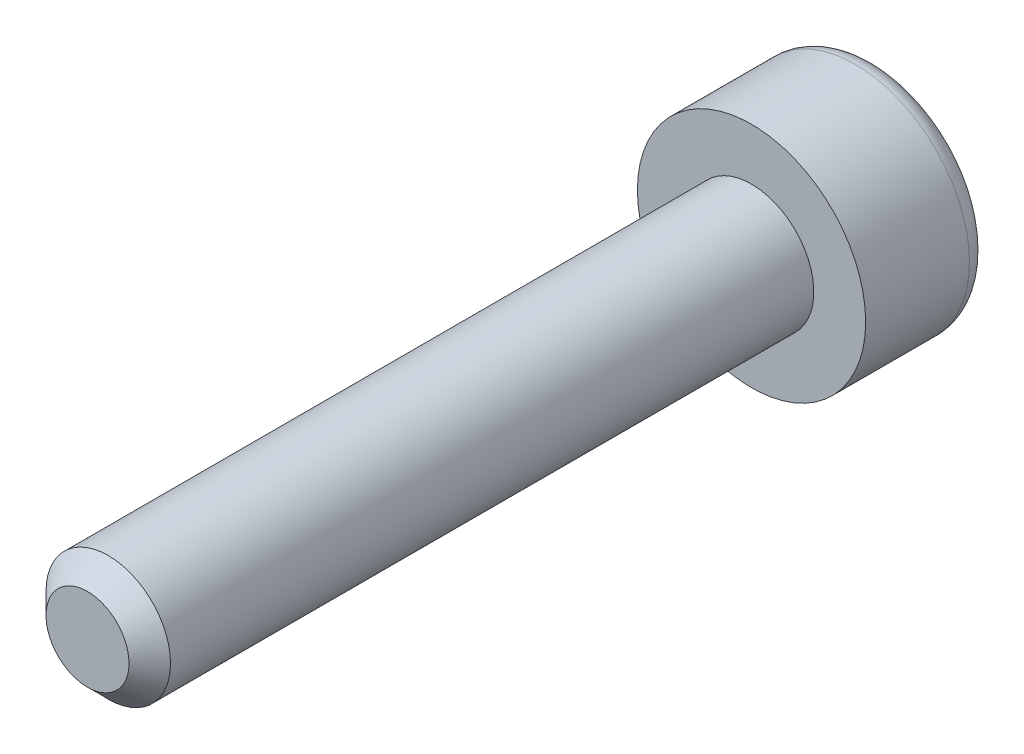
ISO-10303-21;
HEADER;
FILE_DESCRIPTION(('STEP AP214'),'2;1');
FILE_NAME('part.step','',(''),(''),'','','');
FILE_SCHEMA(('AUTOMOTIVE_DESIGN { 1 0 10303 214 1 1 1 1 }'));
ENDSEC;
DATA;
#1=APPLICATION_CONTEXT('core data for automotive mechanical design processes');
#2=APPLICATION_PROTOCOL_DEFINITION('international standard','automotive_design',2000,#1);
#3=PRODUCT_CONTEXT('',#1,'mechanical');
#4=PRODUCT('Part','Part','',(#3));
#5=PRODUCT_RELATED_PRODUCT_CATEGORY('part','',(#4));
#6=PRODUCT_DEFINITION_FORMATION('','',#4);
#7=PRODUCT_DEFINITION_CONTEXT('part definition',#1,'design');
#8=PRODUCT_DEFINITION('design','',#6,#7);
#9=PRODUCT_DEFINITION_SHAPE('','',#8);
#10=(LENGTH_UNIT() NAMED_UNIT(*) SI_UNIT(.MILLI.,.METRE.));
#11=(NAMED_UNIT(*) PLANE_ANGLE_UNIT() SI_UNIT($,.RADIAN.));
#12=(NAMED_UNIT(*) SI_UNIT($,.STERADIAN.) SOLID_ANGLE_UNIT());
#13=UNCERTAINTY_MEASURE_WITH_UNIT(LENGTH_MEASURE(1.E-05),#10,'distance_accuracy_value','');
#14=(GEOMETRIC_REPRESENTATION_CONTEXT(3) GLOBAL_UNCERTAINTY_ASSIGNED_CONTEXT((#13)) GLOBAL_UNIT_ASSIGNED_CONTEXT((#10,
#11,#12)) REPRESENTATION_CONTEXT('',''));
#15=CARTESIAN_POINT('',(0.,0.,0.));
#16=DIRECTION('',(0.,0.,1.));
#17=DIRECTION('',(1.,0.,0.));
#18=AXIS2_PLACEMENT_3D('',#15,#16,#17);
#19=CARTESIAN_POINT('',(0.,0.,16.));
#20=DIRECTION('',(0.,0.,-1.));
#21=DIRECTION('',(-1.,0.,0.));
#22=AXIS2_PLACEMENT_3D('',#19,#20,#21);
#23=CYLINDRICAL_SURFACE('',#22,1.5);
#24=CARTESIAN_POINT('',(0.,0.,15.5));
#25=DIRECTION('',(0.,0.,1.));
#26=DIRECTION('',(1.,0.,0.));
#27=AXIS2_PLACEMENT_3D('',#24,#25,#26);
#28=CIRCLE('',#27,1.5);
#29=CARTESIAN_POINT('',(1.5,0.,15.5));
#30=VERTEX_POINT('',#29);
#31=EDGE_CURVE('E151',#30,#30,#28,.F.);
#32=ORIENTED_EDGE('',*,*,#31,.T.);
#33=EDGE_LOOP('',(#32));
#34=FACE_BOUND('',#33,.T.);
#35=CARTESIAN_POINT('',(0.,0.,0.));
#36=DIRECTION('',(0.,0.,-1.));
#37=DIRECTION('',(-1.,0.,0.));
#38=AXIS2_PLACEMENT_3D('',#35,#36,#37);
#39=CIRCLE('',#38,1.5);
#40=CARTESIAN_POINT('',(-1.5,0.,0.));
#41=VERTEX_POINT('',#40);
#42=EDGE_CURVE('E145',#41,#41,#39,.T.);
#43=ORIENTED_EDGE('',*,*,#42,.F.);
#44=EDGE_LOOP('',(#43));
#45=FACE_BOUND('',#44,.T.);
#46=ADVANCED_FACE('F34',(#34,#45),#23,.T.);
#47=CARTESIAN_POINT('',(0.,0.,16.));
#48=DIRECTION('',(0.,0.,1.));
#49=DIRECTION('',(1.,0.,0.));
#50=AXIS2_PLACEMENT_3D('',#47,#48,#49);
#51=PLANE('',#50);
#52=CARTESIAN_POINT('',(0.,0.,16.));
#53=DIRECTION('',(0.,0.,1.));
#54=DIRECTION('',(1.,0.,0.));
#55=AXIS2_PLACEMENT_3D('',#52,#53,#54);
#56=CIRCLE('',#55,0.999999999999999);
#57=CARTESIAN_POINT('',(0.999999999999999,0.,16.));
#58=VERTEX_POINT('',#57);
#59=EDGE_CURVE('E148',#58,#58,#56,.T.);
#60=ORIENTED_EDGE('',*,*,#59,.T.);
#61=EDGE_LOOP('',(#60));
#62=FACE_BOUND('',#61,.T.);
#63=ADVANCED_FACE('F172',(#62),#51,.T.);
#64=CARTESIAN_POINT('',(0.,0.,16.));
#65=DIRECTION('',(0.,0.,-1.));
#66=DIRECTION('',(-1.,0.,0.));
#67=AXIS2_PLACEMENT_3D('',#64,#65,#66);
#68=CONICAL_SURFACE('',#67,0.999999999999999,0.785398163397445);
#69=ORIENTED_EDGE('',*,*,#31,.F.);
#70=EDGE_LOOP('',(#69));
#71=FACE_BOUND('',#70,.T.);
#72=ORIENTED_EDGE('',*,*,#59,.F.);
#73=EDGE_LOOP('',(#72));
#74=FACE_BOUND('',#73,.T.);
#75=ADVANCED_FACE('F177',(#71,#74),#68,.T.);
#76=CARTESIAN_POINT('',(0.,0.,0.));
#77=DIRECTION('',(0.,0.,-1.));
#78=DIRECTION('',(-1.,0.,0.));
#79=AXIS2_PLACEMENT_3D('',#76,#77,#78);
#80=PLANE('',#79);
#81=CARTESIAN_POINT('',(0.,0.,0.));
#82=DIRECTION('',(0.,0.,-1.));
#83=DIRECTION('',(-1.,0.,0.));
#84=AXIS2_PLACEMENT_3D('',#81,#82,#83);
#85=CIRCLE('',#84,2.75);
#86=CARTESIAN_POINT('',(-2.75,0.,0.));
#87=VERTEX_POINT('',#86);
#88=EDGE_CURVE('E136',#87,#87,#85,.T.);
#89=ORIENTED_EDGE('',*,*,#88,.F.);
#90=EDGE_LOOP('',(#89));
#91=FACE_BOUND('',#90,.T.);
#92=ORIENTED_EDGE('',*,*,#42,.T.);
#93=EDGE_LOOP('',(#92));
#94=FACE_BOUND('',#93,.T.);
#95=ADVANCED_FACE('F183',(#91,#94),#80,.F.);
#96=CARTESIAN_POINT('',(0.,0.,-3.));
#97=DIRECTION('',(0.,0.,1.));
#98=DIRECTION('',(1.,0.,0.));
#99=AXIS2_PLACEMENT_3D('',#96,#97,#98);
#100=CYLINDRICAL_SURFACE('',#99,2.75);
#101=CARTESIAN_POINT('',(0.,0.,-2.5));
#102=DIRECTION('',(0.,0.,-1.));
#103=DIRECTION('',(-1.,0.,0.));
#104=AXIS2_PLACEMENT_3D('',#101,#102,#103);
#105=CIRCLE('',#104,2.75);
#106=CARTESIAN_POINT('',(-2.75,0.,-2.5));
#107=VERTEX_POINT('',#106);
#108=EDGE_CURVE('E11',#107,#107,#105,.F.);
#109=ORIENTED_EDGE('',*,*,#108,.T.);
#110=EDGE_LOOP('',(#109));
#111=FACE_BOUND('',#110,.T.);
#112=ORIENTED_EDGE('',*,*,#88,.T.);
#113=EDGE_LOOP('',(#112));
#114=FACE_BOUND('',#113,.T.);
#115=ADVANCED_FACE('F167',(#111,#114),#100,.T.);
#116=CARTESIAN_POINT('',(0.,0.,-3.));
#117=DIRECTION('',(0.,0.,-1.));
#118=DIRECTION('',(-1.,0.,0.));
#119=AXIS2_PLACEMENT_3D('',#116,#117,#118);
#120=PLANE('',#119);
#121=DIRECTION('',(0.866025403784439,0.5,0.));
#122=VECTOR('',#121,1.);
#123=CARTESIAN_POINT('',(-1.5,0.866025403784438,-3.));
#124=LINE('',#123,#122);
#125=CARTESIAN_POINT('',(-1.5,0.866025403784438,-3.));
#126=VERTEX_POINT('',#125);
#127=CARTESIAN_POINT('',(0.,1.73205080756888,-3.));
#128=VERTEX_POINT('',#127);
#129=EDGE_CURVE('E48',#126,#128,#124,.T.);
#130=ORIENTED_EDGE('',*,*,#129,.F.);
#131=DIRECTION('',(0.,1.,0.));
#132=VECTOR('',#131,1.);
#133=CARTESIAN_POINT('',(-1.5,-0.86602540378444,-3.));
#134=LINE('',#133,#132);
#135=CARTESIAN_POINT('',(-1.5,-0.86602540378444,-3.));
#136=VERTEX_POINT('',#135);
#137=EDGE_CURVE('E118',#136,#126,#134,.T.);
#138=ORIENTED_EDGE('',*,*,#137,.F.);
#139=DIRECTION('',(-0.866025403784439,0.5,0.));
#140=VECTOR('',#139,1.);
#141=CARTESIAN_POINT('',(0.,-1.73205080756888,-3.));
#142=LINE('',#141,#140);
#143=CARTESIAN_POINT('',(0.,-1.73205080756888,-3.));
#144=VERTEX_POINT('',#143);
#145=EDGE_CURVE('E112',#144,#136,#142,.T.);
#146=ORIENTED_EDGE('',*,*,#145,.F.);
#147=DIRECTION('',(-0.866025403784439,-0.5,0.));
#148=VECTOR('',#147,1.);
#149=CARTESIAN_POINT('',(1.5,-0.86602540378444,-3.));
#150=LINE('',#149,#148);
#151=CARTESIAN_POINT('',(1.5,-0.86602540378444,-3.));
#152=VERTEX_POINT('',#151);
#153=EDGE_CURVE('E110',#152,#144,#150,.T.);
#154=ORIENTED_EDGE('',*,*,#153,.F.);
#155=DIRECTION('',(0.,-1.,0.));
#156=VECTOR('',#155,1.);
#157=CARTESIAN_POINT('',(1.5,0.866025403784437,-3.));
#158=LINE('',#157,#156);
#159=CARTESIAN_POINT('',(1.5,0.866025403784437,-3.));
#160=VERTEX_POINT('',#159);
#161=EDGE_CURVE('E91',#160,#152,#158,.T.);
#162=ORIENTED_EDGE('',*,*,#161,.F.);
#163=DIRECTION('',(0.866025403784439,-0.5,0.));
#164=VECTOR('',#163,1.);
#165=CARTESIAN_POINT('',(0.,1.73205080756888,-3.));
#166=LINE('',#165,#164);
#167=EDGE_CURVE('E102',#128,#160,#166,.T.);
#168=ORIENTED_EDGE('',*,*,#167,.F.);
#169=EDGE_LOOP('',(#130,#138,#146,#154,#162,#168));
#170=FACE_BOUND('',#169,.T.);
#171=CARTESIAN_POINT('',(0.,0.,-3.));
#172=DIRECTION('',(0.,0.,-1.));
#173=DIRECTION('',(-1.,0.,0.));
#174=AXIS2_PLACEMENT_3D('',#171,#172,#173);
#175=CIRCLE('',#174,2.25);
#176=CARTESIAN_POINT('',(-2.25,0.,-3.));
#177=VERTEX_POINT('',#176);
#178=EDGE_CURVE('E41',#177,#177,#175,.T.);
#179=ORIENTED_EDGE('',*,*,#178,.T.);
#180=EDGE_LOOP('',(#179));
#181=FACE_BOUND('',#180,.T.);
#182=ADVANCED_FACE('F106',(#170,#181),#120,.T.);
#183=CARTESIAN_POINT('',(0.,0.,-2.5));
#184=DIRECTION('',(0.,0.,-1.));
#185=DIRECTION('',(-1.,0.,0.));
#186=AXIS2_PLACEMENT_3D('',#183,#184,#185);
#187=TOROIDAL_SURFACE('',#186,2.25,0.5);
#188=ORIENTED_EDGE('',*,*,#108,.F.);
#189=EDGE_LOOP('',(#188));
#190=FACE_BOUND('',#189,.T.);
#191=ORIENTED_EDGE('',*,*,#178,.F.);
#192=EDGE_LOOP('',(#191));
#193=FACE_BOUND('',#192,.T.);
#194=ADVANCED_FACE('F156',(#190,#193),#187,.T.);
#195=CARTESIAN_POINT('',(-1.5,0.866025403784438,-1.));
#196=DIRECTION('',(-0.5,0.866025403784439,0.));
#197=DIRECTION('',(-0.866025403784439,-0.5,0.));
#198=AXIS2_PLACEMENT_3D('',#195,#196,#197);
#199=PLANE('',#198);
#200=ORIENTED_EDGE('',*,*,#129,.T.);
#201=DIRECTION('',(0.,0.,-1.));
#202=VECTOR('',#201,1.);
#203=CARTESIAN_POINT('',(0.,1.73205080756888,-1.));
#204=LINE('',#203,#202);
#205=CARTESIAN_POINT('',(0.,1.73205080756888,-1.));
#206=VERTEX_POINT('',#205);
#207=EDGE_CURVE('E99',#206,#128,#204,.T.);
#208=ORIENTED_EDGE('',*,*,#207,.F.);
#209=DIRECTION('',(0.866025403784439,0.5,0.));
#210=VECTOR('',#209,1.);
#211=CARTESIAN_POINT('',(-1.5,0.866025403784438,-1.));
#212=LINE('',#211,#210);
#213=CARTESIAN_POINT('',(-1.5,0.866025403784438,-1.));
#214=VERTEX_POINT('',#213);
#215=EDGE_CURVE('E120',#214,#206,#212,.T.);
#216=ORIENTED_EDGE('',*,*,#215,.F.);
#217=DIRECTION('',(0.,0.,-1.));
#218=VECTOR('',#217,1.);
#219=CARTESIAN_POINT('',(-1.5,0.866025403784438,-1.));
#220=LINE('',#219,#218);
#221=EDGE_CURVE('E55',#214,#126,#220,.T.);
#222=ORIENTED_EDGE('',*,*,#221,.T.);
#223=EDGE_LOOP('',(#200,#208,#216,#222));
#224=FACE_BOUND('',#223,.T.);
#225=ADVANCED_FACE('F158',(#224),#199,.F.);
#226=CARTESIAN_POINT('',(-1.5,-0.86602540378444,-1.));
#227=DIRECTION('',(-1.,0.,0.));
#228=DIRECTION('',(0.,0.,1.));
#229=AXIS2_PLACEMENT_3D('',#226,#227,#228);
#230=PLANE('',#229);
#231=ORIENTED_EDGE('',*,*,#137,.T.);
#232=ORIENTED_EDGE('',*,*,#221,.F.);
#233=DIRECTION('',(0.,1.,0.));
#234=VECTOR('',#233,1.);
#235=CARTESIAN_POINT('',(-1.5,-0.86602540378444,-1.));
#236=LINE('',#235,#234);
#237=CARTESIAN_POINT('',(-1.5,-0.86602540378444,-1.));
#238=VERTEX_POINT('',#237);
#239=EDGE_CURVE('E132',#238,#214,#236,.T.);
#240=ORIENTED_EDGE('',*,*,#239,.F.);
#241=DIRECTION('',(0.,0.,-1.));
#242=VECTOR('',#241,1.);
#243=CARTESIAN_POINT('',(-1.5,-0.86602540378444,-1.));
#244=LINE('',#243,#242);
#245=EDGE_CURVE('E137',#238,#136,#244,.T.);
#246=ORIENTED_EDGE('',*,*,#245,.T.);
#247=EDGE_LOOP('',(#231,#232,#240,#246));
#248=FACE_BOUND('',#247,.T.);
#249=ADVANCED_FACE('F165',(#248),#230,.F.);
#250=CARTESIAN_POINT('',(0.,-1.73205080756888,-1.));
#251=DIRECTION('',(-0.5,-0.866025403784439,0.));
#252=DIRECTION('',(0.866025403784439,-0.5,0.));
#253=AXIS2_PLACEMENT_3D('',#250,#251,#252);
#254=PLANE('',#253);
#255=ORIENTED_EDGE('',*,*,#145,.T.);
#256=ORIENTED_EDGE('',*,*,#245,.F.);
#257=DIRECTION('',(-0.866025403784439,0.5,0.));
#258=VECTOR('',#257,1.);
#259=CARTESIAN_POINT('',(0.,-1.73205080756888,-1.));
#260=LINE('',#259,#258);
#261=CARTESIAN_POINT('',(0.,-1.73205080756888,-1.));
#262=VERTEX_POINT('',#261);
#263=EDGE_CURVE('E129',#262,#238,#260,.T.);
#264=ORIENTED_EDGE('',*,*,#263,.F.);
#265=DIRECTION('',(0.,0.,-1.));
#266=VECTOR('',#265,1.);
#267=CARTESIAN_POINT('',(0.,-1.73205080756888,-1.));
#268=LINE('',#267,#266);
#269=EDGE_CURVE('E139',#262,#144,#268,.T.);
#270=ORIENTED_EDGE('',*,*,#269,.T.);
#271=EDGE_LOOP('',(#255,#256,#264,#270));
#272=FACE_BOUND('',#271,.T.);
#273=ADVANCED_FACE('F243',(#272),#254,.F.);
#274=CARTESIAN_POINT('',(1.5,-0.86602540378444,-1.));
#275=DIRECTION('',(0.5,-0.866025403784439,0.));
#276=DIRECTION('',(0.866025403784439,0.5,0.));
#277=AXIS2_PLACEMENT_3D('',#274,#275,#276);
#278=PLANE('',#277);
#279=ORIENTED_EDGE('',*,*,#153,.T.);
#280=ORIENTED_EDGE('',*,*,#269,.F.);
#281=DIRECTION('',(-0.866025403784439,-0.5,0.));
#282=VECTOR('',#281,1.);
#283=CARTESIAN_POINT('',(1.5,-0.86602540378444,-1.));
#284=LINE('',#283,#282);
#285=CARTESIAN_POINT('',(1.5,-0.86602540378444,-1.));
#286=VERTEX_POINT('',#285);
#287=EDGE_CURVE('E126',#286,#262,#284,.T.);
#288=ORIENTED_EDGE('',*,*,#287,.F.);
#289=DIRECTION('',(0.,0.,-1.));
#290=VECTOR('',#289,1.);
#291=CARTESIAN_POINT('',(1.5,-0.86602540378444,-1.));
#292=LINE('',#291,#290);
#293=EDGE_CURVE('E98',#286,#152,#292,.T.);
#294=ORIENTED_EDGE('',*,*,#293,.T.);
#295=EDGE_LOOP('',(#279,#280,#288,#294));
#296=FACE_BOUND('',#295,.T.);
#297=ADVANCED_FACE('F251',(#296),#278,.F.);
#298=CARTESIAN_POINT('',(1.5,0.866025403784437,-1.));
#299=DIRECTION('',(1.,0.,0.));
#300=DIRECTION('',(0.,1.,0.));
#301=AXIS2_PLACEMENT_3D('',#298,#299,#300);
#302=PLANE('',#301);
#303=ORIENTED_EDGE('',*,*,#161,.T.);
#304=ORIENTED_EDGE('',*,*,#293,.F.);
#305=DIRECTION('',(0.,-1.,0.));
#306=VECTOR('',#305,1.);
#307=CARTESIAN_POINT('',(1.5,0.866025403784437,-1.));
#308=LINE('',#307,#306);
#309=CARTESIAN_POINT('',(1.5,0.866025403784437,-1.));
#310=VERTEX_POINT('',#309);
#311=EDGE_CURVE('E94',#310,#286,#308,.T.);
#312=ORIENTED_EDGE('',*,*,#311,.F.);
#313=DIRECTION('',(0.,0.,-1.));
#314=VECTOR('',#313,1.);
#315=CARTESIAN_POINT('',(1.5,0.866025403784437,-1.));
#316=LINE('',#315,#314);
#317=EDGE_CURVE('E87',#310,#160,#316,.T.);
#318=ORIENTED_EDGE('',*,*,#317,.T.);
#319=EDGE_LOOP('',(#303,#304,#312,#318));
#320=FACE_BOUND('',#319,.T.);
#321=ADVANCED_FACE('F89',(#320),#302,.F.);
#322=CARTESIAN_POINT('',(0.,1.73205080756888,-1.));
#323=DIRECTION('',(0.5,0.866025403784439,0.));
#324=DIRECTION('',(-0.866025403784439,0.5,0.));
#325=AXIS2_PLACEMENT_3D('',#322,#323,#324);
#326=PLANE('',#325);
#327=ORIENTED_EDGE('',*,*,#167,.T.);
#328=ORIENTED_EDGE('',*,*,#317,.F.);
#329=DIRECTION('',(0.866025403784439,-0.5,0.));
#330=VECTOR('',#329,1.);
#331=CARTESIAN_POINT('',(0.,1.73205080756888,-1.));
#332=LINE('',#331,#330);
#333=EDGE_CURVE('E123',#206,#310,#332,.T.);
#334=ORIENTED_EDGE('',*,*,#333,.F.);
#335=ORIENTED_EDGE('',*,*,#207,.T.);
#336=EDGE_LOOP('',(#327,#328,#334,#335));
#337=FACE_BOUND('',#336,.T.);
#338=ADVANCED_FACE('F103',(#337),#326,.F.);
#339=CARTESIAN_POINT('',(-1.5,0.866025403784438,-1.));
#340=DIRECTION('',(0.,0.,1.));
#341=DIRECTION('',(1.,0.,0.));
#342=AXIS2_PLACEMENT_3D('',#339,#340,#341);
#343=PLANE('',#342);
#344=ORIENTED_EDGE('',*,*,#215,.T.);
#345=ORIENTED_EDGE('',*,*,#333,.T.);
#346=ORIENTED_EDGE('',*,*,#311,.T.);
#347=ORIENTED_EDGE('',*,*,#287,.T.);
#348=ORIENTED_EDGE('',*,*,#263,.T.);
#349=ORIENTED_EDGE('',*,*,#239,.T.);
#350=EDGE_LOOP('',(#344,#345,#346,#347,#348,#349));
#351=FACE_BOUND('',#350,.T.);
#352=ADVANCED_FACE('F275',(#351),#343,.F.);
#353=CLOSED_SHELL('',(#46,#63,#75,#95,#115,#182,#194,#225,#249,#273,#297,#321,#338,#352));
#354=MANIFOLD_SOLID_BREP('B2',#353);
#355=ADVANCED_BREP_SHAPE_REPRESENTATION('',(#18,#354),#14);
#356=SHAPE_DEFINITION_REPRESENTATION(#9,#355);
ENDSEC;
END-ISO-10303-21;
